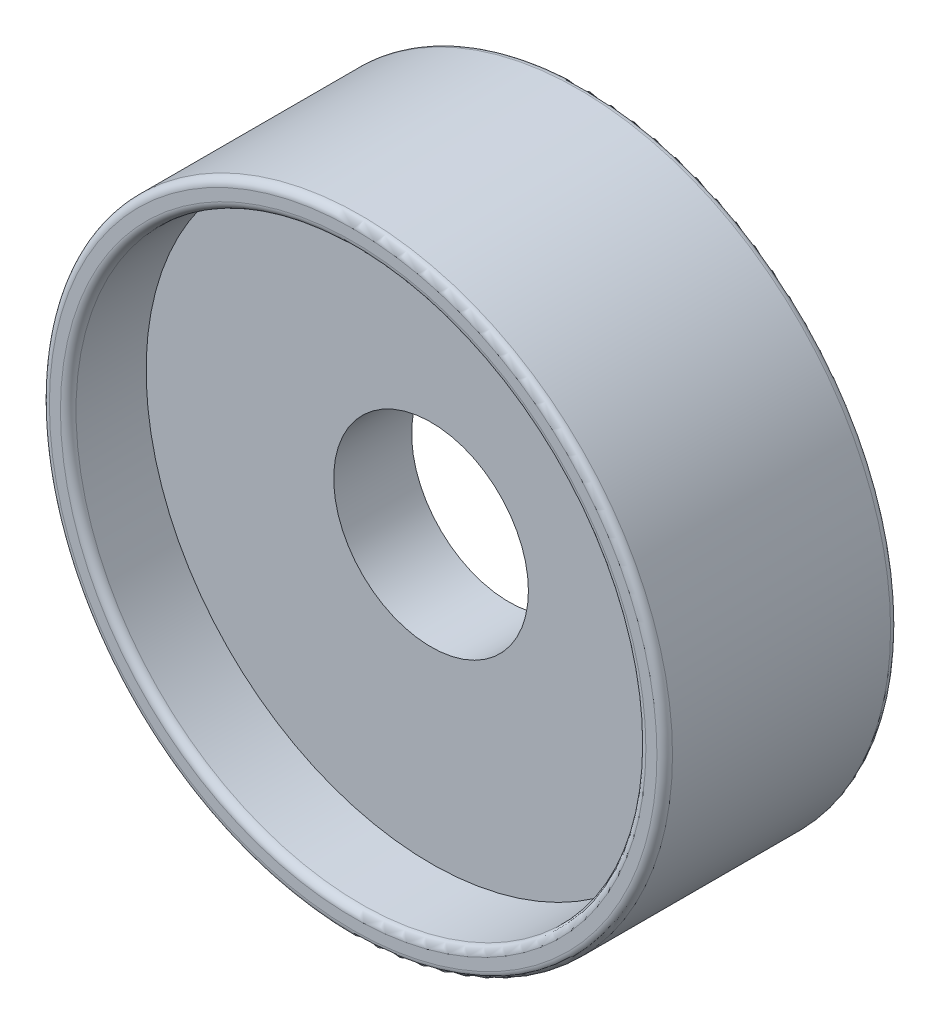
ISO-10303-21;
HEADER;
FILE_DESCRIPTION(('STEP AP214'),'2;1');
FILE_NAME('part.step','',(''),(''),'','','');
FILE_SCHEMA(('AUTOMOTIVE_DESIGN { 1 0 10303 214 1 1 1 1 }'));
ENDSEC;
DATA;
#1=APPLICATION_CONTEXT('core data for automotive mechanical design processes');
#2=APPLICATION_PROTOCOL_DEFINITION('international standard','automotive_design',2000,#1);
#3=PRODUCT_CONTEXT('',#1,'mechanical');
#4=PRODUCT('Part','Part','',(#3));
#5=PRODUCT_RELATED_PRODUCT_CATEGORY('part','',(#4));
#6=PRODUCT_DEFINITION_FORMATION('','',#4);
#7=PRODUCT_DEFINITION_CONTEXT('part definition',#1,'design');
#8=PRODUCT_DEFINITION('design','',#6,#7);
#9=PRODUCT_DEFINITION_SHAPE('','',#8);
#10=(LENGTH_UNIT() NAMED_UNIT(*) SI_UNIT(.MILLI.,.METRE.));
#11=(NAMED_UNIT(*) PLANE_ANGLE_UNIT() SI_UNIT($,.RADIAN.));
#12=(NAMED_UNIT(*) SI_UNIT($,.STERADIAN.) SOLID_ANGLE_UNIT());
#13=UNCERTAINTY_MEASURE_WITH_UNIT(LENGTH_MEASURE(1.E-05),#10,'distance_accuracy_value','');
#14=(GEOMETRIC_REPRESENTATION_CONTEXT(3) GLOBAL_UNCERTAINTY_ASSIGNED_CONTEXT((#13)) GLOBAL_UNIT_ASSIGNED_CONTEXT((#10,
#11,#12)) REPRESENTATION_CONTEXT('',''));
#15=CARTESIAN_POINT('',(0.,0.,0.));
#16=DIRECTION('',(0.,0.,1.));
#17=DIRECTION('',(1.,0.,0.));
#18=AXIS2_PLACEMENT_3D('',#15,#16,#17);
#19=CARTESIAN_POINT('',(0.,0.,-38.1));
#20=DIRECTION('',(0.,0.,1.));
#21=DIRECTION('',(1.,0.,0.));
#22=AXIS2_PLACEMENT_3D('',#19,#20,#21);
#23=CYLINDRICAL_SURFACE('',#22,31.75);
#24=CARTESIAN_POINT('',(0.,0.,12.7));
#25=DIRECTION('',(0.,0.,1.));
#26=DIRECTION('',(1.,0.,0.));
#27=AXIS2_PLACEMENT_3D('',#24,#25,#26);
#28=CIRCLE('',#27,31.75);
#29=CARTESIAN_POINT('',(31.75,0.,12.7));
#30=VERTEX_POINT('',#29);
#31=EDGE_CURVE('E73',#30,#30,#28,.F.);
#32=CARTESIAN_POINT('',(0.,0.,-12.7));
#33=DIRECTION('',(0.,0.,-1.));
#34=DIRECTION('',(-1.,0.,0.));
#35=AXIS2_PLACEMENT_3D('',#32,#33,#34);
#36=CIRCLE('',#35,31.75);
#37=CARTESIAN_POINT('',(31.75,0.,-12.7));
#38=VERTEX_POINT('',#37);
#39=EDGE_CURVE('E74',#38,#38,#36,.F.);
#40=CARTESIAN_POINT('',(31.75,0.,12.7));
#41=CARTESIAN_POINT('',(31.75,0.,12.4354166666667));
#42=CARTESIAN_POINT('',(31.75,0.,12.1708333333333));
#43=CARTESIAN_POINT('',(31.75,0.,11.6416666666667));
#44=CARTESIAN_POINT('',(31.75,0.,11.3770833333333));
#45=CARTESIAN_POINT('',(31.75,0.,10.8479166666667));
#46=CARTESIAN_POINT('',(31.75,0.,10.5833333333333));
#47=CARTESIAN_POINT('',(31.75,0.,10.0541666666667));
#48=CARTESIAN_POINT('',(31.75,0.,9.78958333333334));
#49=CARTESIAN_POINT('',(31.75,0.,9.26041666666667));
#50=CARTESIAN_POINT('',(31.75,0.,8.99583333333334));
#51=CARTESIAN_POINT('',(31.75,0.,8.46666666666667));
#52=CARTESIAN_POINT('',(31.75,0.,8.20208333333333));
#53=CARTESIAN_POINT('',(31.75,0.,7.67291666666667));
#54=CARTESIAN_POINT('',(31.75,0.,7.40833333333334));
#55=CARTESIAN_POINT('',(31.75,0.,6.87916666666667));
#56=CARTESIAN_POINT('',(31.75,0.,6.61458333333333));
#57=CARTESIAN_POINT('',(31.75,0.,6.08541666666667));
#58=CARTESIAN_POINT('',(31.75,0.,5.82083333333333));
#59=CARTESIAN_POINT('',(31.75,0.,5.29166666666667));
#60=CARTESIAN_POINT('',(31.75,0.,5.02708333333333));
#61=CARTESIAN_POINT('',(31.75,0.,4.49791666666667));
#62=CARTESIAN_POINT('',(31.75,0.,4.23333333333333));
#63=CARTESIAN_POINT('',(31.75,0.,3.70416666666667));
#64=CARTESIAN_POINT('',(31.75,0.,3.43958333333333));
#65=CARTESIAN_POINT('',(31.75,0.,2.91041666666667));
#66=CARTESIAN_POINT('',(31.75,0.,2.64583333333333));
#67=CARTESIAN_POINT('',(31.75,0.,2.11666666666667));
#68=CARTESIAN_POINT('',(31.75,0.,1.85208333333333));
#69=CARTESIAN_POINT('',(31.75,0.,1.32291666666666));
#70=CARTESIAN_POINT('',(31.75,0.,1.05833333333333));
#71=CARTESIAN_POINT('',(31.75,0.,0.529166666666664));
#72=CARTESIAN_POINT('',(31.75,0.,0.264583333333332));
#73=CARTESIAN_POINT('',(31.75,0.,-0.264583333333332));
#74=CARTESIAN_POINT('',(31.75,0.,-0.529166666666664));
#75=CARTESIAN_POINT('',(31.75,0.,-1.05833333333333));
#76=CARTESIAN_POINT('',(31.75,0.,-1.32291666666666));
#77=CARTESIAN_POINT('',(31.75,0.,-1.85208333333333));
#78=CARTESIAN_POINT('',(31.75,0.,-2.11666666666667));
#79=CARTESIAN_POINT('',(31.75,0.,-2.64583333333333));
#80=CARTESIAN_POINT('',(31.75,0.,-2.91041666666667));
#81=CARTESIAN_POINT('',(31.75,0.,-3.43958333333333));
#82=CARTESIAN_POINT('',(31.75,0.,-3.70416666666667));
#83=CARTESIAN_POINT('',(31.75,0.,-4.23333333333333));
#84=CARTESIAN_POINT('',(31.75,0.,-4.49791666666667));
#85=CARTESIAN_POINT('',(31.75,0.,-5.02708333333333));
#86=CARTESIAN_POINT('',(31.75,0.,-5.29166666666667));
#87=CARTESIAN_POINT('',(31.75,0.,-5.82083333333333));
#88=CARTESIAN_POINT('',(31.75,0.,-6.08541666666667));
#89=CARTESIAN_POINT('',(31.75,0.,-6.61458333333333));
#90=CARTESIAN_POINT('',(31.75,0.,-6.87916666666667));
#91=CARTESIAN_POINT('',(31.75,0.,-7.40833333333333));
#92=CARTESIAN_POINT('',(31.75,0.,-7.67291666666666));
#93=CARTESIAN_POINT('',(31.75,0.,-8.20208333333333));
#94=CARTESIAN_POINT('',(31.75,0.,-8.46666666666667));
#95=CARTESIAN_POINT('',(31.75,0.,-8.99583333333333));
#96=CARTESIAN_POINT('',(31.75,0.,-9.26041666666666));
#97=CARTESIAN_POINT('',(31.75,0.,-9.78958333333333));
#98=CARTESIAN_POINT('',(31.75,0.,-10.0541666666667));
#99=CARTESIAN_POINT('',(31.75,0.,-10.5833333333333));
#100=CARTESIAN_POINT('',(31.75,0.,-10.8479166666667));
#101=CARTESIAN_POINT('',(31.75,0.,-11.3770833333333));
#102=CARTESIAN_POINT('',(31.75,0.,-11.6416666666667));
#103=CARTESIAN_POINT('',(31.75,0.,-12.1708333333333));
#104=CARTESIAN_POINT('',(31.75,0.,-12.4354166666667));
#105=CARTESIAN_POINT('',(31.75,0.,-12.7));
#106=B_SPLINE_CURVE_WITH_KNOTS('',3,(#40,#41,#42,#43,#44,#45,#46,#47,#48,#49,#50,#51,#52,#53,
#54,#55,#56,#57,#58,#59,#60,#61,#62,#63,#64,#65,#66,#67,#68,#69,#70,#71,#72,#73,#74,#75,#76,#77,
#78,#79,#80,#81,#82,#83,#84,#85,#86,#87,#88,#89,#90,#91,#92,#93,#94,#95,#96,#97,#98,#99,#100,
#101,#102,#103,#104,#105),.UNSPECIFIED.,.F.,.F.,(4,2,2,2,2,2,2,2,2,2,2,2,2,2,2,2,2,2,2,2,2,2,2,
2,2,2,2,2,2,2,2,2,4),(0.,0.793750000000003,1.5875,2.38125,3.175,3.96875,4.7625,5.55625,6.35,
7.14375,7.9375,8.73125,9.52500000000001,10.31875,11.1125,11.90625,12.7,13.49375,14.2875,
15.08125,15.875,16.66875,17.4625,18.25625,19.05,19.84375,20.6375,21.43125,22.225,23.01875,
23.8125,24.60625,25.4),.UNSPECIFIED.);
#107=EDGE_CURVE('BSEAM41',#30,#38,#106,.T.);
#108=ORIENTED_EDGE('',*,*,#31,.F.);
#109=ORIENTED_EDGE('',*,*,#39,.F.);
#110=ORIENTED_EDGE('',*,*,#107,.T.);
#111=ORIENTED_EDGE('',*,*,#107,.F.);
#112=EDGE_LOOP('',(#108,#110,#109,#111));
#113=FACE_BOUND('',#112,.T.);
#114=ADVANCED_FACE('F41',(#113),#23,.F.);
#115=CARTESIAN_POINT('',(0.,0.,-38.1));
#116=DIRECTION('',(0.,0.,1.));
#117=DIRECTION('',(1.,0.,0.));
#118=AXIS2_PLACEMENT_3D('',#115,#116,#117);
#119=CYLINDRICAL_SURFACE('',#118,101.6);
#120=CARTESIAN_POINT('',(0.,0.,35.56));
#121=DIRECTION('',(0.,0.,1.));
#122=DIRECTION('',(1.,0.,0.));
#123=AXIS2_PLACEMENT_3D('',#120,#121,#122);
#124=CIRCLE('',#123,101.6);
#125=CARTESIAN_POINT('',(101.6,0.,35.56));
#126=VERTEX_POINT('',#125);
#127=EDGE_CURVE('E48',#126,#126,#124,.F.);
#128=CARTESIAN_POINT('',(0.,0.,-35.56));
#129=DIRECTION('',(0.,0.,1.));
#130=DIRECTION('',(1.,0.,0.));
#131=AXIS2_PLACEMENT_3D('',#128,#129,#130);
#132=CIRCLE('',#131,101.6);
#133=CARTESIAN_POINT('',(101.6,0.,-35.56));
#134=VERTEX_POINT('',#133);
#135=EDGE_CURVE('E70',#134,#134,#132,.T.);
#136=CARTESIAN_POINT('',(101.6,0.,35.56));
#137=CARTESIAN_POINT('',(101.6,0.,34.8191666666667));
#138=CARTESIAN_POINT('',(101.6,0.,34.0783333333333));
#139=CARTESIAN_POINT('',(101.6,0.,32.5966666666666));
#140=CARTESIAN_POINT('',(101.6,0.,31.8558333333333));
#141=CARTESIAN_POINT('',(101.6,0.,30.3741666666667));
#142=CARTESIAN_POINT('',(101.6,0.,29.6333333333333));
#143=CARTESIAN_POINT('',(101.6,0.,28.1516666666667));
#144=CARTESIAN_POINT('',(101.6,0.,27.4108333333333));
#145=CARTESIAN_POINT('',(101.6,0.,25.9291666666667));
#146=CARTESIAN_POINT('',(101.6,0.,25.1883333333333));
#147=CARTESIAN_POINT('',(101.6,0.,23.7066666666667));
#148=CARTESIAN_POINT('',(101.6,0.,22.9658333333333));
#149=CARTESIAN_POINT('',(101.6,0.,21.4841666666667));
#150=CARTESIAN_POINT('',(101.6,0.,20.7433333333333));
#151=CARTESIAN_POINT('',(101.6,0.,19.2616666666667));
#152=CARTESIAN_POINT('',(101.6,0.,18.5208333333333));
#153=CARTESIAN_POINT('',(101.6,0.,17.0391666666667));
#154=CARTESIAN_POINT('',(101.6,0.,16.2983333333333));
#155=CARTESIAN_POINT('',(101.6,0.,14.8166666666667));
#156=CARTESIAN_POINT('',(101.6,0.,14.0758333333333));
#157=CARTESIAN_POINT('',(101.6,0.,12.5941666666667));
#158=CARTESIAN_POINT('',(101.6,0.,11.8533333333333));
#159=CARTESIAN_POINT('',(101.6,0.,10.3716666666667));
#160=CARTESIAN_POINT('',(101.6,0.,9.63083333333333));
#161=CARTESIAN_POINT('',(101.6,0.,8.14916666666666));
#162=CARTESIAN_POINT('',(101.6,0.,7.40833333333333));
#163=CARTESIAN_POINT('',(101.6,0.,5.92666666666666));
#164=CARTESIAN_POINT('',(101.6,0.,5.18583333333332));
#165=CARTESIAN_POINT('',(101.6,0.,3.70416666666666));
#166=CARTESIAN_POINT('',(101.6,0.,2.96333333333333));
#167=CARTESIAN_POINT('',(101.6,0.,1.48166666666666));
#168=CARTESIAN_POINT('',(101.6,0.,0.740833333333327));
#169=CARTESIAN_POINT('',(101.6,0.,-0.740833333333341));
#170=CARTESIAN_POINT('',(101.6,0.,-1.48166666666667));
#171=CARTESIAN_POINT('',(101.6,0.,-2.96333333333334));
#172=CARTESIAN_POINT('',(101.6,0.,-3.70416666666667));
#173=CARTESIAN_POINT('',(101.6,0.,-5.18583333333334));
#174=CARTESIAN_POINT('',(101.6,0.,-5.92666666666667));
#175=CARTESIAN_POINT('',(101.6,0.,-7.40833333333334));
#176=CARTESIAN_POINT('',(101.6,0.,-8.14916666666667));
#177=CARTESIAN_POINT('',(101.6,0.,-9.63083333333334));
#178=CARTESIAN_POINT('',(101.6,0.,-10.3716666666667));
#179=CARTESIAN_POINT('',(101.6,0.,-11.8533333333333));
#180=CARTESIAN_POINT('',(101.6,0.,-12.5941666666667));
#181=CARTESIAN_POINT('',(101.6,0.,-14.0758333333333));
#182=CARTESIAN_POINT('',(101.6,0.,-14.8166666666667));
#183=CARTESIAN_POINT('',(101.6,0.,-16.2983333333333));
#184=CARTESIAN_POINT('',(101.6,0.,-17.0391666666667));
#185=CARTESIAN_POINT('',(101.6,0.,-18.5208333333333));
#186=CARTESIAN_POINT('',(101.6,0.,-19.2616666666667));
#187=CARTESIAN_POINT('',(101.6,0.,-20.7433333333333));
#188=CARTESIAN_POINT('',(101.6,0.,-21.4841666666667));
#189=CARTESIAN_POINT('',(101.6,0.,-22.9658333333333));
#190=CARTESIAN_POINT('',(101.6,0.,-23.7066666666667));
#191=CARTESIAN_POINT('',(101.6,0.,-25.1883333333333));
#192=CARTESIAN_POINT('',(101.6,0.,-25.9291666666667));
#193=CARTESIAN_POINT('',(101.6,0.,-27.4108333333333));
#194=CARTESIAN_POINT('',(101.6,0.,-28.1516666666667));
#195=CARTESIAN_POINT('',(101.6,0.,-29.6333333333333));
#196=CARTESIAN_POINT('',(101.6,0.,-30.3741666666667));
#197=CARTESIAN_POINT('',(101.6,0.,-31.8558333333333));
#198=CARTESIAN_POINT('',(101.6,0.,-32.5966666666667));
#199=CARTESIAN_POINT('',(101.6,0.,-34.0783333333333));
#200=CARTESIAN_POINT('',(101.6,0.,-34.8191666666667));
#201=CARTESIAN_POINT('',(101.6,0.,-35.56));
#202=B_SPLINE_CURVE_WITH_KNOTS('',3,(#136,#137,#138,#139,#140,#141,#142,#143,#144,#145,#146,
#147,#148,#149,#150,#151,#152,#153,#154,#155,#156,#157,#158,#159,#160,#161,#162,#163,#164,#165,
#166,#167,#168,#169,#170,#171,#172,#173,#174,#175,#176,#177,#178,#179,#180,#181,#182,#183,#184,
#185,#186,#187,#188,#189,#190,#191,#192,#193,#194,#195,#196,#197,#198,#199,#200,#201),
.UNSPECIFIED.,.F.,.F.,(4,2,2,2,2,2,2,2,2,2,2,2,2,2,2,2,2,2,2,2,2,2,2,2,2,2,2,2,2,2,2,2,4),(0.,
2.2225,4.445,6.66749999999999,8.89,11.1125,13.335,15.5575,17.78,20.0025,22.225,24.4475,26.67,
28.8925,31.115,33.3375,35.56,37.7825,40.005,42.2275,44.45,46.6725,48.895,51.1175,53.34,55.5625,
57.785,60.0075,62.23,64.4525,66.675,68.8975,71.12),.UNSPECIFIED.);
#203=EDGE_CURVE('BSEAM96',#126,#134,#202,.T.);
#204=ORIENTED_EDGE('',*,*,#127,.T.);
#205=ORIENTED_EDGE('',*,*,#135,.T.);
#206=ORIENTED_EDGE('',*,*,#203,.T.);
#207=ORIENTED_EDGE('',*,*,#203,.F.);
#208=EDGE_LOOP('',(#204,#206,#205,#207));
#209=FACE_BOUND('',#208,.T.);
#210=ADVANCED_FACE('F96',(#209),#119,.T.);
#211=CARTESIAN_POINT('',(0.,0.,-38.1));
#212=DIRECTION('',(0.,0.,1.));
#213=DIRECTION('',(1.,0.,0.));
#214=AXIS2_PLACEMENT_3D('',#211,#212,#213);
#215=PLANE('',#214);
#216=CARTESIAN_POINT('',(0.,0.,-38.1));
#217=DIRECTION('',(0.,0.,1.));
#218=DIRECTION('',(1.,0.,0.));
#219=AXIS2_PLACEMENT_3D('',#216,#217,#218);
#220=CIRCLE('',#219,99.0599999999999);
#221=CARTESIAN_POINT('',(99.0599999999999,0.,-38.1));
#222=VERTEX_POINT('',#221);
#223=EDGE_CURVE('E64',#222,#222,#220,.F.);
#224=ORIENTED_EDGE('',*,*,#223,.T.);
#225=EDGE_LOOP('',(#224));
#226=FACE_BOUND('',#225,.T.);
#227=CARTESIAN_POINT('',(0.,0.,-38.1));
#228=DIRECTION('',(0.,0.,1.));
#229=DIRECTION('',(1.,0.,0.));
#230=AXIS2_PLACEMENT_3D('',#227,#228,#229);
#231=CIRCLE('',#230,95.4585115657437);
#232=CARTESIAN_POINT('',(95.4585115657437,0.,-38.1));
#233=VERTEX_POINT('',#232);
#234=EDGE_CURVE('E67',#233,#233,#231,.T.);
#235=ORIENTED_EDGE('',*,*,#234,.T.);
#236=EDGE_LOOP('',(#235));
#237=FACE_BOUND('',#236,.T.);
#238=ADVANCED_FACE('F103',(#226,#237),#215,.F.);
#239=CARTESIAN_POINT('',(0.,0.,38.1));
#240=DIRECTION('',(0.,0.,1.));
#241=DIRECTION('',(1.,0.,0.));
#242=AXIS2_PLACEMENT_3D('',#239,#240,#241);
#243=PLANE('',#242);
#244=CARTESIAN_POINT('',(0.,0.,38.1));
#245=DIRECTION('',(0.,0.,1.));
#246=DIRECTION('',(1.,0.,0.));
#247=AXIS2_PLACEMENT_3D('',#244,#245,#246);
#248=CIRCLE('',#247,99.0599999999999);
#249=CARTESIAN_POINT('',(99.0599999999999,0.,38.1));
#250=VERTEX_POINT('',#249);
#251=EDGE_CURVE('E52',#250,#250,#248,.T.);
#252=ORIENTED_EDGE('',*,*,#251,.T.);
#253=EDGE_LOOP('',(#252));
#254=FACE_BOUND('',#253,.T.);
#255=CARTESIAN_POINT('',(0.,0.,38.1));
#256=DIRECTION('',(0.,0.,1.));
#257=DIRECTION('',(1.,0.,0.));
#258=AXIS2_PLACEMENT_3D('',#255,#256,#257);
#259=CIRCLE('',#258,95.4585115657437);
#260=CARTESIAN_POINT('',(95.4585115657437,0.,38.1));
#261=VERTEX_POINT('',#260);
#262=EDGE_CURVE('E56',#261,#261,#259,.F.);
#263=ORIENTED_EDGE('',*,*,#262,.T.);
#264=EDGE_LOOP('',(#263));
#265=FACE_BOUND('',#264,.T.);
#266=ADVANCED_FACE('F111',(#254,#265),#243,.T.);
#267=CARTESIAN_POINT('',(0.,0.,12.7));
#268=DIRECTION('',(0.,0.,1.));
#269=DIRECTION('',(1.,0.,0.));
#270=AXIS2_PLACEMENT_3D('',#267,#268,#269);
#271=PLANE('',#270);
#272=CARTESIAN_POINT('',(0.,0.,12.7));
#273=DIRECTION('',(0.,0.,1.));
#274=DIRECTION('',(1.,0.,0.));
#275=AXIS2_PLACEMENT_3D('',#272,#273,#274);
#276=CIRCLE('',#275,92.9185115657437);
#277=CARTESIAN_POINT('',(92.9185115657437,0.,12.7));
#278=VERTEX_POINT('',#277);
#279=EDGE_CURVE('E77',#278,#278,#276,.T.);
#280=ORIENTED_EDGE('',*,*,#279,.T.);
#281=EDGE_LOOP('',(#280));
#282=FACE_BOUND('',#281,.T.);
#283=ORIENTED_EDGE('',*,*,#31,.T.);
#284=EDGE_LOOP('',(#283));
#285=FACE_BOUND('',#284,.T.);
#286=ADVANCED_FACE('F114',(#282,#285),#271,.T.);
#287=CARTESIAN_POINT('',(0.,0.,12.7));
#288=DIRECTION('',(0.,0.,1.));
#289=DIRECTION('',(1.,0.,0.));
#290=AXIS2_PLACEMENT_3D('',#287,#288,#289);
#291=CYLINDRICAL_SURFACE('',#290,92.9185115657437);
#292=CARTESIAN_POINT('',(0.,0.,35.56));
#293=DIRECTION('',(0.,0.,1.));
#294=DIRECTION('',(1.,0.,0.));
#295=AXIS2_PLACEMENT_3D('',#292,#293,#294);
#296=CIRCLE('',#295,92.9185115657437);
#297=CARTESIAN_POINT('',(92.9185115657437,0.,35.56));
#298=VERTEX_POINT('',#297);
#299=EDGE_CURVE('E10',#298,#298,#296,.T.);
#300=ORIENTED_EDGE('',*,*,#299,.T.);
#301=EDGE_LOOP('',(#300));
#302=FACE_BOUND('',#301,.T.);
#303=ORIENTED_EDGE('',*,*,#279,.F.);
#304=EDGE_LOOP('',(#303));
#305=FACE_BOUND('',#304,.T.);
#306=ADVANCED_FACE('F91',(#302,#305),#291,.F.);
#307=CARTESIAN_POINT('',(0.,0.,-12.7));
#308=DIRECTION('',(0.,0.,-1.));
#309=DIRECTION('',(1.,0.,0.));
#310=AXIS2_PLACEMENT_3D('',#307,#308,#309);
#311=PLANE('',#310);
#312=CARTESIAN_POINT('',(0.,0.,-12.7));
#313=DIRECTION('',(0.,0.,1.));
#314=DIRECTION('',(1.,0.,0.));
#315=AXIS2_PLACEMENT_3D('',#312,#313,#314);
#316=CIRCLE('',#315,92.9185115657437);
#317=CARTESIAN_POINT('',(92.9185115657437,0.,-12.7));
#318=VERTEX_POINT('',#317);
#319=EDGE_CURVE('E78',#318,#318,#316,.T.);
#320=ORIENTED_EDGE('',*,*,#319,.F.);
#321=EDGE_LOOP('',(#320));
#322=FACE_BOUND('',#321,.T.);
#323=ORIENTED_EDGE('',*,*,#39,.T.);
#324=EDGE_LOOP('',(#323));
#325=FACE_BOUND('',#324,.T.);
#326=ADVANCED_FACE('F88',(#322,#325),#311,.T.);
#327=CARTESIAN_POINT('',(0.,0.,-12.7));
#328=DIRECTION('',(0.,0.,-1.));
#329=DIRECTION('',(-1.,0.,0.));
#330=AXIS2_PLACEMENT_3D('',#327,#328,#329);
#331=CYLINDRICAL_SURFACE('',#330,92.9185115657437);
#332=CARTESIAN_POINT('',(0.,0.,-35.56));
#333=DIRECTION('',(0.,0.,1.));
#334=DIRECTION('',(1.,0.,0.));
#335=AXIS2_PLACEMENT_3D('',#332,#333,#334);
#336=CIRCLE('',#335,92.9185115657437);
#337=CARTESIAN_POINT('',(92.9185115657437,0.,-35.56));
#338=VERTEX_POINT('',#337);
#339=EDGE_CURVE('E61',#338,#338,#336,.F.);
#340=ORIENTED_EDGE('',*,*,#339,.T.);
#341=EDGE_LOOP('',(#340));
#342=FACE_BOUND('',#341,.T.);
#343=ORIENTED_EDGE('',*,*,#319,.T.);
#344=EDGE_LOOP('',(#343));
#345=FACE_BOUND('',#344,.T.);
#346=ADVANCED_FACE('F86',(#342,#345),#331,.F.);
#347=CARTESIAN_POINT('',(0.,0.,-35.56));
#348=DIRECTION('',(0.,0.,1.));
#349=DIRECTION('',(1.,0.,0.));
#350=AXIS2_PLACEMENT_3D('',#347,#348,#349);
#351=TOROIDAL_SURFACE('',#350,99.0599999999999,2.54);
#352=ORIENTED_EDGE('',*,*,#223,.F.);
#353=EDGE_LOOP('',(#352));
#354=FACE_BOUND('',#353,.T.);
#355=ORIENTED_EDGE('',*,*,#135,.F.);
#356=EDGE_LOOP('',(#355));
#357=FACE_BOUND('',#356,.T.);
#358=ADVANCED_FACE('F117',(#354,#357),#351,.T.);
#359=CARTESIAN_POINT('',(0.,0.,-35.56));
#360=DIRECTION('',(0.,0.,1.));
#361=DIRECTION('',(1.,0.,0.));
#362=AXIS2_PLACEMENT_3D('',#359,#360,#361);
#363=TOROIDAL_SURFACE('',#362,95.4585115657437,2.54);
#364=ORIENTED_EDGE('',*,*,#339,.F.);
#365=EDGE_LOOP('',(#364));
#366=FACE_BOUND('',#365,.T.);
#367=ORIENTED_EDGE('',*,*,#234,.F.);
#368=EDGE_LOOP('',(#367));
#369=FACE_BOUND('',#368,.T.);
#370=ADVANCED_FACE('F120',(#366,#369),#363,.T.);
#371=CARTESIAN_POINT('',(0.,0.,35.56));
#372=DIRECTION('',(0.,0.,1.));
#373=DIRECTION('',(1.,0.,0.));
#374=AXIS2_PLACEMENT_3D('',#371,#372,#373);
#375=TOROIDAL_SURFACE('',#374,99.0599999999999,2.54);
#376=ORIENTED_EDGE('',*,*,#127,.F.);
#377=EDGE_LOOP('',(#376));
#378=FACE_BOUND('',#377,.T.);
#379=ORIENTED_EDGE('',*,*,#251,.F.);
#380=EDGE_LOOP('',(#379));
#381=FACE_BOUND('',#380,.T.);
#382=ADVANCED_FACE('F123',(#378,#381),#375,.T.);
#383=CARTESIAN_POINT('',(0.,0.,35.56));
#384=DIRECTION('',(0.,0.,1.));
#385=DIRECTION('',(1.,0.,0.));
#386=AXIS2_PLACEMENT_3D('',#383,#384,#385);
#387=TOROIDAL_SURFACE('',#386,95.4585115657437,2.54);
#388=ORIENTED_EDGE('',*,*,#262,.F.);
#389=EDGE_LOOP('',(#388));
#390=FACE_BOUND('',#389,.T.);
#391=ORIENTED_EDGE('',*,*,#299,.F.);
#392=EDGE_LOOP('',(#391));
#393=FACE_BOUND('',#392,.T.);
#394=ADVANCED_FACE('F43',(#390,#393),#387,.T.);
#395=CLOSED_SHELL('',(#114,#210,#238,#266,#286,#306,#326,#346,#358,#370,#382,#394));
#396=MANIFOLD_SOLID_BREP('B2',#395);
#397=ADVANCED_BREP_SHAPE_REPRESENTATION('',(#18,#396),#14);
#398=SHAPE_DEFINITION_REPRESENTATION(#9,#397);
ENDSEC;
END-ISO-10303-21;
